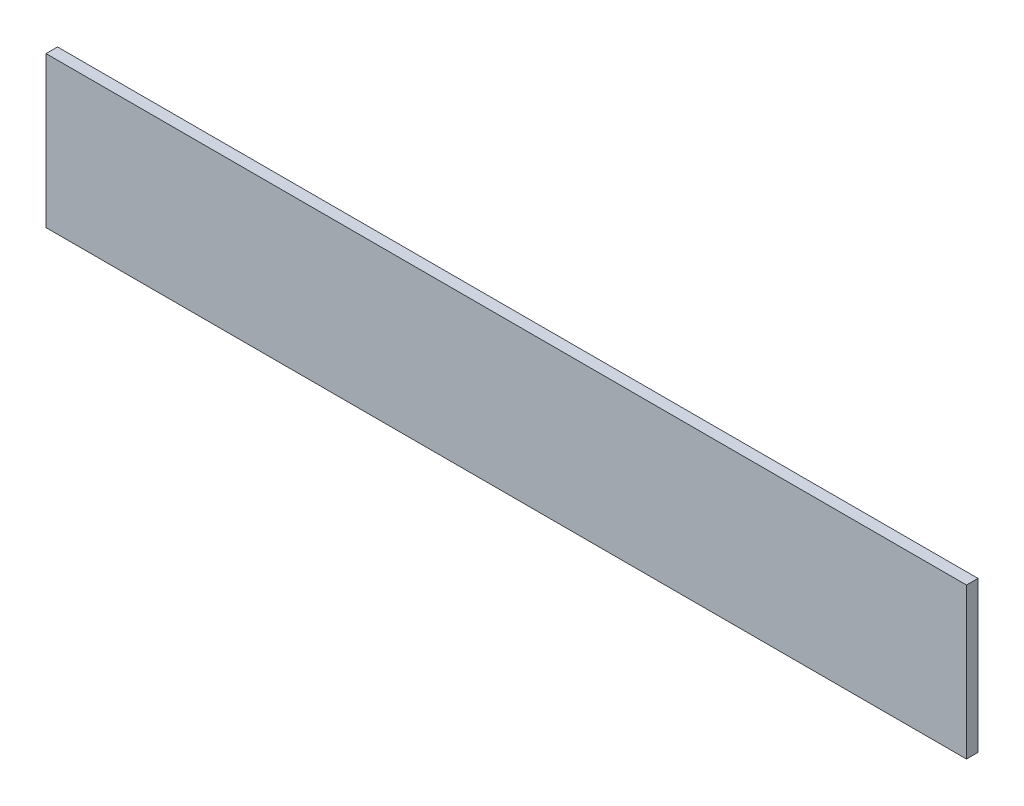
ISO-10303-21;
HEADER;
FILE_DESCRIPTION(('STEP AP214'),'2;1');
FILE_NAME('part.step','',(''),(''),'','','');
FILE_SCHEMA(('AUTOMOTIVE_DESIGN { 1 0 10303 214 1 1 1 1 }'));
ENDSEC;
DATA;
#1=APPLICATION_CONTEXT('core data for automotive mechanical design processes');
#2=APPLICATION_PROTOCOL_DEFINITION('international standard','automotive_design',2000,#1);
#3=PRODUCT_CONTEXT('',#1,'mechanical');
#4=PRODUCT('Part','Part','',(#3));
#5=PRODUCT_RELATED_PRODUCT_CATEGORY('part','',(#4));
#6=PRODUCT_DEFINITION_FORMATION('','',#4);
#7=PRODUCT_DEFINITION_CONTEXT('part definition',#1,'design');
#8=PRODUCT_DEFINITION('design','',#6,#7);
#9=PRODUCT_DEFINITION_SHAPE('','',#8);
#10=(LENGTH_UNIT() NAMED_UNIT(*) SI_UNIT(.MILLI.,.METRE.));
#11=(NAMED_UNIT(*) PLANE_ANGLE_UNIT() SI_UNIT($,.RADIAN.));
#12=(NAMED_UNIT(*) SI_UNIT($,.STERADIAN.) SOLID_ANGLE_UNIT());
#13=UNCERTAINTY_MEASURE_WITH_UNIT(LENGTH_MEASURE(1.E-05),#10,'distance_accuracy_value','');
#14=(GEOMETRIC_REPRESENTATION_CONTEXT(3) GLOBAL_UNCERTAINTY_ASSIGNED_CONTEXT((#13)) GLOBAL_UNIT_ASSIGNED_CONTEXT((#10,
#11,#12)) REPRESENTATION_CONTEXT('',''));
#15=CARTESIAN_POINT('',(0.,0.,0.));
#16=DIRECTION('',(0.,0.,1.));
#17=DIRECTION('',(1.,0.,0.));
#18=AXIS2_PLACEMENT_3D('',#15,#16,#17);
#19=CARTESIAN_POINT('',(-40.,6.55,1.));
#20=DIRECTION('',(1.,0.,0.));
#21=DIRECTION('',(0.,0.,-1.));
#22=AXIS2_PLACEMENT_3D('',#19,#20,#21);
#23=PLANE('',#22);
#24=DIRECTION('',(0.,-1.,0.));
#25=VECTOR('',#24,1.);
#26=CARTESIAN_POINT('',(-40.,6.55,0.));
#27=LINE('',#26,#25);
#28=CARTESIAN_POINT('',(-40.,6.55,0.));
#29=VERTEX_POINT('',#28);
#30=CARTESIAN_POINT('',(-40.,-6.55,0.));
#31=VERTEX_POINT('',#30);
#32=EDGE_CURVE('E101',#29,#31,#27,.T.);
#33=ORIENTED_EDGE('',*,*,#32,.T.);
#34=DIRECTION('',(0.,0.,-1.));
#35=VECTOR('',#34,1.);
#36=CARTESIAN_POINT('',(-40.,-6.55,1.));
#37=LINE('',#36,#35);
#38=CARTESIAN_POINT('',(-40.,-6.55,1.));
#39=VERTEX_POINT('',#38);
#40=EDGE_CURVE('E11',#39,#31,#37,.T.);
#41=ORIENTED_EDGE('',*,*,#40,.F.);
#42=DIRECTION('',(0.,-1.,0.));
#43=VECTOR('',#42,1.);
#44=CARTESIAN_POINT('',(-40.,6.55,1.));
#45=LINE('',#44,#43);
#46=CARTESIAN_POINT('',(-40.,6.55,1.));
#47=VERTEX_POINT('',#46);
#48=EDGE_CURVE('E89',#47,#39,#45,.T.);
#49=ORIENTED_EDGE('',*,*,#48,.F.);
#50=DIRECTION('',(0.,0.,-1.));
#51=VECTOR('',#50,1.);
#52=CARTESIAN_POINT('',(-40.,6.55,1.));
#53=LINE('',#52,#51);
#54=EDGE_CURVE('E97',#47,#29,#53,.T.);
#55=ORIENTED_EDGE('',*,*,#54,.T.);
#56=EDGE_LOOP('',(#33,#41,#49,#55));
#57=FACE_BOUND('',#56,.T.);
#58=ADVANCED_FACE('F38',(#57),#23,.F.);
#59=CARTESIAN_POINT('',(-40.,-6.55,1.));
#60=DIRECTION('',(0.,1.,0.));
#61=DIRECTION('',(0.,0.,1.));
#62=AXIS2_PLACEMENT_3D('',#59,#60,#61);
#63=PLANE('',#62);
#64=DIRECTION('',(1.,0.,0.));
#65=VECTOR('',#64,1.);
#66=CARTESIAN_POINT('',(-40.,-6.55,0.));
#67=LINE('',#66,#65);
#68=CARTESIAN_POINT('',(40.,-6.55,0.));
#69=VERTEX_POINT('',#68);
#70=EDGE_CURVE('E93',#31,#69,#67,.T.);
#71=ORIENTED_EDGE('',*,*,#70,.T.);
#72=DIRECTION('',(0.,0.,-1.));
#73=VECTOR('',#72,1.);
#74=CARTESIAN_POINT('',(40.,-6.55,1.));
#75=LINE('',#74,#73);
#76=CARTESIAN_POINT('',(40.,-6.55,1.));
#77=VERTEX_POINT('',#76);
#78=EDGE_CURVE('E46',#77,#69,#75,.T.);
#79=ORIENTED_EDGE('',*,*,#78,.F.);
#80=DIRECTION('',(1.,0.,0.));
#81=VECTOR('',#80,1.);
#82=CARTESIAN_POINT('',(-40.,-6.55,1.));
#83=LINE('',#82,#81);
#84=EDGE_CURVE('E84',#39,#77,#83,.T.);
#85=ORIENTED_EDGE('',*,*,#84,.F.);
#86=ORIENTED_EDGE('',*,*,#40,.T.);
#87=EDGE_LOOP('',(#71,#79,#85,#86));
#88=FACE_BOUND('',#87,.T.);
#89=ADVANCED_FACE('F92',(#88),#63,.F.);
#90=CARTESIAN_POINT('',(40.,6.55,1.));
#91=DIRECTION('',(-1.,0.,0.));
#92=DIRECTION('',(0.,0.,1.));
#93=AXIS2_PLACEMENT_3D('',#90,#91,#92);
#94=PLANE('',#93);
#95=DIRECTION('',(0.,1.,0.));
#96=VECTOR('',#95,1.);
#97=CARTESIAN_POINT('',(40.,6.55,0.));
#98=LINE('',#97,#96);
#99=CARTESIAN_POINT('',(40.,6.55,0.));
#100=VERTEX_POINT('',#99);
#101=EDGE_CURVE('E71',#69,#100,#98,.T.);
#102=ORIENTED_EDGE('',*,*,#101,.T.);
#103=DIRECTION('',(0.,0.,-1.));
#104=VECTOR('',#103,1.);
#105=CARTESIAN_POINT('',(40.,6.55,1.));
#106=LINE('',#105,#104);
#107=CARTESIAN_POINT('',(40.,6.55,1.));
#108=VERTEX_POINT('',#107);
#109=EDGE_CURVE('E94',#108,#100,#106,.T.);
#110=ORIENTED_EDGE('',*,*,#109,.F.);
#111=DIRECTION('',(0.,1.,0.));
#112=VECTOR('',#111,1.);
#113=CARTESIAN_POINT('',(40.,6.55,1.));
#114=LINE('',#113,#112);
#115=EDGE_CURVE('E87',#77,#108,#114,.T.);
#116=ORIENTED_EDGE('',*,*,#115,.F.);
#117=ORIENTED_EDGE('',*,*,#78,.T.);
#118=EDGE_LOOP('',(#102,#110,#116,#117));
#119=FACE_BOUND('',#118,.T.);
#120=ADVANCED_FACE('F95',(#119),#94,.F.);
#121=CARTESIAN_POINT('',(-40.,6.55,1.));
#122=DIRECTION('',(0.,-1.,0.));
#123=DIRECTION('',(0.,0.,-1.));
#124=AXIS2_PLACEMENT_3D('',#121,#122,#123);
#125=PLANE('',#124);
#126=DIRECTION('',(-1.,0.,0.));
#127=VECTOR('',#126,1.);
#128=CARTESIAN_POINT('',(-40.,6.55,0.));
#129=LINE('',#128,#127);
#130=EDGE_CURVE('E77',#100,#29,#129,.T.);
#131=ORIENTED_EDGE('',*,*,#130,.T.);
#132=ORIENTED_EDGE('',*,*,#54,.F.);
#133=DIRECTION('',(-1.,0.,0.));
#134=VECTOR('',#133,1.);
#135=CARTESIAN_POINT('',(-40.,6.55,1.));
#136=LINE('',#135,#134);
#137=EDGE_CURVE('E54',#108,#47,#136,.T.);
#138=ORIENTED_EDGE('',*,*,#137,.F.);
#139=ORIENTED_EDGE('',*,*,#109,.T.);
#140=EDGE_LOOP('',(#131,#132,#138,#139));
#141=FACE_BOUND('',#140,.T.);
#142=ADVANCED_FACE('F108',(#141),#125,.F.);
#143=CARTESIAN_POINT('',(0.,0.,1.));
#144=DIRECTION('',(0.,0.,1.));
#145=DIRECTION('',(1.,0.,0.));
#146=AXIS2_PLACEMENT_3D('',#143,#144,#145);
#147=PLANE('',#146);
#148=ORIENTED_EDGE('',*,*,#48,.T.);
#149=ORIENTED_EDGE('',*,*,#84,.T.);
#150=ORIENTED_EDGE('',*,*,#115,.T.);
#151=ORIENTED_EDGE('',*,*,#137,.T.);
#152=EDGE_LOOP('',(#148,#149,#150,#151));
#153=FACE_BOUND('',#152,.T.);
#154=ADVANCED_FACE('F85',(#153),#147,.T.);
#155=CARTESIAN_POINT('',(0.,0.,0.));
#156=DIRECTION('',(0.,0.,1.));
#157=DIRECTION('',(1.,0.,0.));
#158=AXIS2_PLACEMENT_3D('',#155,#156,#157);
#159=PLANE('',#158);
#160=ORIENTED_EDGE('',*,*,#32,.F.);
#161=ORIENTED_EDGE('',*,*,#130,.F.);
#162=ORIENTED_EDGE('',*,*,#101,.F.);
#163=ORIENTED_EDGE('',*,*,#70,.F.);
#164=EDGE_LOOP('',(#160,#161,#162,#163));
#165=FACE_BOUND('',#164,.T.);
#166=ADVANCED_FACE('F111',(#165),#159,.F.);
#167=CLOSED_SHELL('',(#58,#89,#120,#142,#154,#166));
#168=MANIFOLD_SOLID_BREP('B2',#167);
#169=ADVANCED_BREP_SHAPE_REPRESENTATION('',(#18,#168),#14);
#170=SHAPE_DEFINITION_REPRESENTATION(#9,#169);
ENDSEC;
END-ISO-10303-21;
